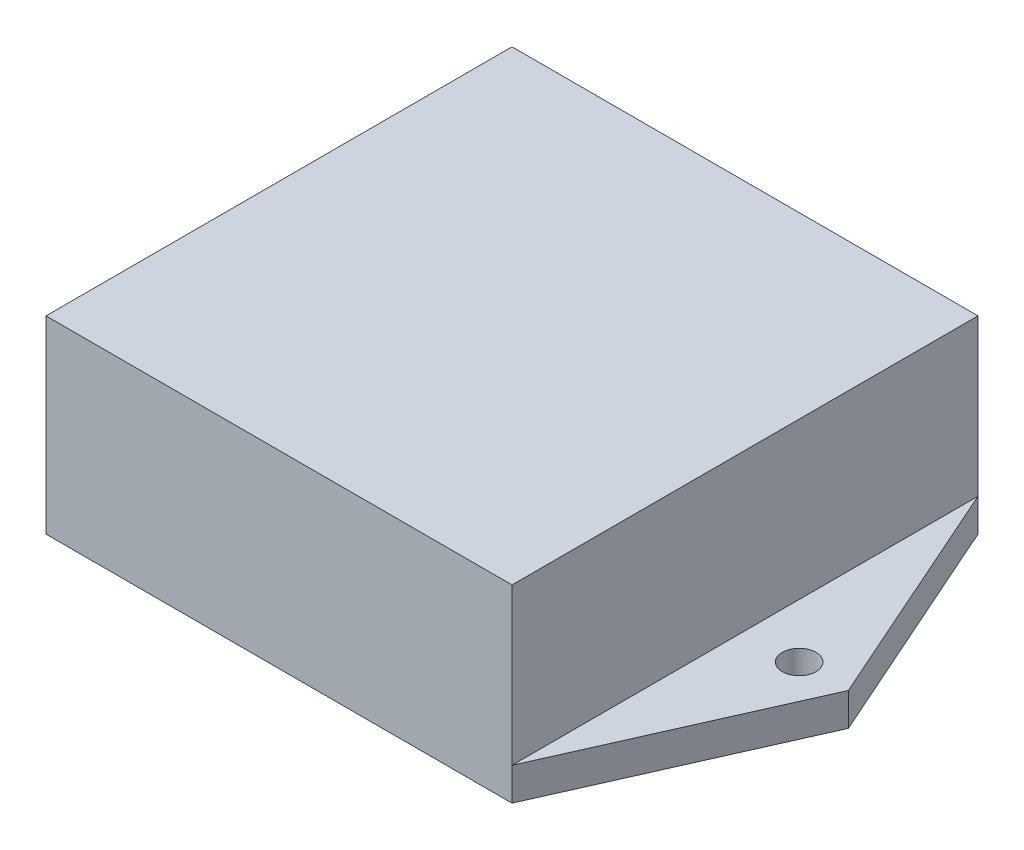
ISO-10303-21;
HEADER;
FILE_DESCRIPTION(('STEP AP214'),'2;1');
FILE_NAME('part.step','',(''),(''),'','','');
FILE_SCHEMA(('AUTOMOTIVE_DESIGN { 1 0 10303 214 1 1 1 1 }'));
ENDSEC;
DATA;
#1=APPLICATION_CONTEXT('core data for automotive mechanical design processes');
#2=APPLICATION_PROTOCOL_DEFINITION('international standard','automotive_design',2000,#1);
#3=PRODUCT_CONTEXT('',#1,'mechanical');
#4=PRODUCT('Part','Part','',(#3));
#5=PRODUCT_RELATED_PRODUCT_CATEGORY('part','',(#4));
#6=PRODUCT_DEFINITION_FORMATION('','',#4);
#7=PRODUCT_DEFINITION_CONTEXT('part definition',#1,'design');
#8=PRODUCT_DEFINITION('design','',#6,#7);
#9=PRODUCT_DEFINITION_SHAPE('','',#8);
#10=(LENGTH_UNIT() NAMED_UNIT(*) SI_UNIT(.MILLI.,.METRE.));
#11=(NAMED_UNIT(*) PLANE_ANGLE_UNIT() SI_UNIT($,.RADIAN.));
#12=(NAMED_UNIT(*) SI_UNIT($,.STERADIAN.) SOLID_ANGLE_UNIT());
#13=UNCERTAINTY_MEASURE_WITH_UNIT(LENGTH_MEASURE(1.E-05),#10,'distance_accuracy_value','');
#14=(GEOMETRIC_REPRESENTATION_CONTEXT(3) GLOBAL_UNCERTAINTY_ASSIGNED_CONTEXT((#13)) GLOBAL_UNIT_ASSIGNED_CONTEXT((#10,
#11,#12)) REPRESENTATION_CONTEXT('',''));
#15=CARTESIAN_POINT('',(0.,0.,0.));
#16=DIRECTION('',(0.,0.,1.));
#17=DIRECTION('',(1.,0.,0.));
#18=AXIS2_PLACEMENT_3D('',#15,#16,#17);
#19=CARTESIAN_POINT('',(0.,2.,0.));
#20=DIRECTION('',(0.,1.,0.));
#21=DIRECTION('',(0.,0.,1.));
#22=AXIS2_PLACEMENT_3D('',#19,#20,#21);
#23=PLANE('',#22);
#24=CARTESIAN_POINT('',(17.5,2.,0.));
#25=DIRECTION('',(0.,1.,0.));
#26=DIRECTION('',(0.,0.,1.));
#27=AXIS2_PLACEMENT_3D('',#24,#25,#26);
#28=CIRCLE('',#27,1.025);
#29=CARTESIAN_POINT('',(17.5,2.,1.025));
#30=VERTEX_POINT('',#29);
#31=EDGE_CURVE('E200',#30,#30,#28,.T.);
#32=ORIENTED_EDGE('',*,*,#31,.F.);
#33=EDGE_LOOP('',(#32));
#34=FACE_BOUND('',#33,.T.);
#35=DIRECTION('',(0.405541116982609,0.,0.914076803357627));
#36=VECTOR('',#35,1.);
#37=CARTESIAN_POINT('',(17.1284962499482,2.,-7.59926242075167));
#38=LINE('',#37,#36);
#39=CARTESIAN_POINT('',(14.2,2.,-14.2));
#40=VERTEX_POINT('',#39);
#41=CARTESIAN_POINT('',(20.5,2.,0.));
#42=VERTEX_POINT('',#41);
#43=EDGE_CURVE('E118',#40,#42,#38,.T.);
#44=ORIENTED_EDGE('',*,*,#43,.F.);
#45=DIRECTION('',(0.,0.,1.));
#46=VECTOR('',#45,1.);
#47=CARTESIAN_POINT('',(14.2,2.,0.));
#48=LINE('',#47,#46);
#49=CARTESIAN_POINT('',(14.2,2.,14.2));
#50=VERTEX_POINT('',#49);
#51=EDGE_CURVE('E106',#40,#50,#48,.T.);
#52=ORIENTED_EDGE('',*,*,#51,.T.);
#53=DIRECTION('',(-0.405541116982609,0.,0.914076803357627));
#54=VECTOR('',#53,1.);
#55=CARTESIAN_POINT('',(17.1284962499482,2.,7.59926242075167));
#56=LINE('',#55,#54);
#57=EDGE_CURVE('E129',#42,#50,#56,.T.);
#58=ORIENTED_EDGE('',*,*,#57,.F.);
#59=EDGE_LOOP('',(#44,#52,#58));
#60=FACE_BOUND('',#59,.T.);
#61=ADVANCED_FACE('F49',(#34,#60),#23,.T.);
#62=CARTESIAN_POINT('',(0.,2.,14.2));
#63=DIRECTION('',(0.,0.,-1.));
#64=DIRECTION('',(-1.,0.,0.));
#65=AXIS2_PLACEMENT_3D('',#62,#63,#64);
#66=PLANE('',#65);
#67=DIRECTION('',(1.,0.,0.));
#68=VECTOR('',#67,1.);
#69=CARTESIAN_POINT('',(0.,0.,14.2));
#70=LINE('',#69,#68);
#71=CARTESIAN_POINT('',(-14.2,0.,14.2));
#72=VERTEX_POINT('',#71);
#73=CARTESIAN_POINT('',(14.2,0.,14.2));
#74=VERTEX_POINT('',#73);
#75=EDGE_CURVE('E143',#72,#74,#70,.T.);
#76=ORIENTED_EDGE('',*,*,#75,.T.);
#77=DIRECTION('',(0.,-1.,0.));
#78=VECTOR('',#77,1.);
#79=CARTESIAN_POINT('',(14.2,2.,14.2));
#80=LINE('',#79,#78);
#81=EDGE_CURVE('E11',#50,#74,#80,.T.);
#82=ORIENTED_EDGE('',*,*,#81,.F.);
#83=DIRECTION('',(0.,-1.,0.));
#84=VECTOR('',#83,1.);
#85=CARTESIAN_POINT('',(14.2,11.52,14.2));
#86=LINE('',#85,#84);
#87=CARTESIAN_POINT('',(14.2,11.52,14.2));
#88=VERTEX_POINT('',#87);
#89=EDGE_CURVE('E141',#88,#50,#86,.T.);
#90=ORIENTED_EDGE('',*,*,#89,.F.);
#91=DIRECTION('',(1.,0.,0.));
#92=VECTOR('',#91,1.);
#93=CARTESIAN_POINT('',(0.,11.52,14.2));
#94=LINE('',#93,#92);
#95=CARTESIAN_POINT('',(-14.2,11.52,14.2));
#96=VERTEX_POINT('',#95);
#97=EDGE_CURVE('E199',#96,#88,#94,.T.);
#98=ORIENTED_EDGE('',*,*,#97,.F.);
#99=DIRECTION('',(0.,-1.,0.));
#100=VECTOR('',#99,1.);
#101=CARTESIAN_POINT('',(-14.2,11.52,14.2));
#102=LINE('',#101,#100);
#103=CARTESIAN_POINT('',(-14.2,2.,14.2));
#104=VERTEX_POINT('',#103);
#105=EDGE_CURVE('E157',#96,#104,#102,.T.);
#106=ORIENTED_EDGE('',*,*,#105,.T.);
#107=DIRECTION('',(0.,-1.,0.));
#108=VECTOR('',#107,1.);
#109=CARTESIAN_POINT('',(-14.2,2.,14.2));
#110=LINE('',#109,#108);
#111=EDGE_CURVE('E171',#104,#72,#110,.T.);
#112=ORIENTED_EDGE('',*,*,#111,.T.);
#113=EDGE_LOOP('',(#76,#82,#90,#98,#106,#112));
#114=FACE_BOUND('',#113,.T.);
#115=ADVANCED_FACE('F51',(#114),#66,.F.);
#116=CARTESIAN_POINT('',(17.1284962499482,2.,7.59926242075167));
#117=DIRECTION('',(0.914076803357627,0.,0.405541116982609));
#118=DIRECTION('',(0.405541116982609,0.,-0.914076803357627));
#119=AXIS2_PLACEMENT_3D('',#116,#117,#118);
#120=PLANE('',#119);
#121=DIRECTION('',(-0.405541116982609,0.,0.914076803357627));
#122=VECTOR('',#121,1.);
#123=CARTESIAN_POINT('',(17.1284962499482,0.,7.59926242075167));
#124=LINE('',#123,#122);
#125=CARTESIAN_POINT('',(20.5,0.,0.));
#126=VERTEX_POINT('',#125);
#127=EDGE_CURVE('E175',#126,#74,#124,.T.);
#128=ORIENTED_EDGE('',*,*,#127,.F.);
#129=DIRECTION('',(0.,-1.,0.));
#130=VECTOR('',#129,1.);
#131=CARTESIAN_POINT('',(20.5,2.,0.));
#132=LINE('',#131,#130);
#133=EDGE_CURVE('E60',#42,#126,#132,.T.);
#134=ORIENTED_EDGE('',*,*,#133,.F.);
#135=ORIENTED_EDGE('',*,*,#57,.T.);
#136=ORIENTED_EDGE('',*,*,#81,.T.);
#137=EDGE_LOOP('',(#128,#134,#135,#136));
#138=FACE_BOUND('',#137,.T.);
#139=ADVANCED_FACE('F244',(#138),#120,.T.);
#140=CARTESIAN_POINT('',(17.1284962499482,2.,-7.59926242075167));
#141=DIRECTION('',(0.914076803357627,0.,-0.405541116982609));
#142=DIRECTION('',(-0.405541116982609,0.,-0.914076803357627));
#143=AXIS2_PLACEMENT_3D('',#140,#141,#142);
#144=PLANE('',#143);
#145=DIRECTION('',(0.405541116982609,0.,0.914076803357627));
#146=VECTOR('',#145,1.);
#147=CARTESIAN_POINT('',(17.1284962499482,0.,-7.59926242075167));
#148=LINE('',#147,#146);
#149=CARTESIAN_POINT('',(14.2,0.,-14.2));
#150=VERTEX_POINT('',#149);
#151=EDGE_CURVE('E120',#150,#126,#148,.T.);
#152=ORIENTED_EDGE('',*,*,#151,.F.);
#153=DIRECTION('',(0.,-1.,0.));
#154=VECTOR('',#153,1.);
#155=CARTESIAN_POINT('',(14.2,2.,-14.2));
#156=LINE('',#155,#154);
#157=EDGE_CURVE('E116',#40,#150,#156,.T.);
#158=ORIENTED_EDGE('',*,*,#157,.F.);
#159=ORIENTED_EDGE('',*,*,#43,.T.);
#160=ORIENTED_EDGE('',*,*,#133,.T.);
#161=EDGE_LOOP('',(#152,#158,#159,#160));
#162=FACE_BOUND('',#161,.T.);
#163=ADVANCED_FACE('F117',(#162),#144,.T.);
#164=CARTESIAN_POINT('',(0.,2.,-14.2));
#165=DIRECTION('',(0.,0.,-1.));
#166=DIRECTION('',(-1.,0.,0.));
#167=AXIS2_PLACEMENT_3D('',#164,#165,#166);
#168=PLANE('',#167);
#169=DIRECTION('',(1.,0.,0.));
#170=VECTOR('',#169,1.);
#171=CARTESIAN_POINT('',(0.,0.,-14.2));
#172=LINE('',#171,#170);
#173=CARTESIAN_POINT('',(-14.2,0.,-14.2));
#174=VERTEX_POINT('',#173);
#175=EDGE_CURVE('E181',#174,#150,#172,.T.);
#176=ORIENTED_EDGE('',*,*,#175,.F.);
#177=DIRECTION('',(0.,-1.,0.));
#178=VECTOR('',#177,1.);
#179=CARTESIAN_POINT('',(-14.2,2.,-14.2));
#180=LINE('',#179,#178);
#181=CARTESIAN_POINT('',(-14.2,2.,-14.2));
#182=VERTEX_POINT('',#181);
#183=EDGE_CURVE('E126',#182,#174,#180,.T.);
#184=ORIENTED_EDGE('',*,*,#183,.F.);
#185=DIRECTION('',(0.,-1.,0.));
#186=VECTOR('',#185,1.);
#187=CARTESIAN_POINT('',(-14.2,11.52,-14.2));
#188=LINE('',#187,#186);
#189=CARTESIAN_POINT('',(-14.2,11.52,-14.2));
#190=VERTEX_POINT('',#189);
#191=EDGE_CURVE('E151',#190,#182,#188,.T.);
#192=ORIENTED_EDGE('',*,*,#191,.F.);
#193=DIRECTION('',(1.,0.,0.));
#194=VECTOR('',#193,1.);
#195=CARTESIAN_POINT('',(0.,11.52,-14.2));
#196=LINE('',#195,#194);
#197=CARTESIAN_POINT('',(14.2,11.52,-14.2));
#198=VERTEX_POINT('',#197);
#199=EDGE_CURVE('E149',#190,#198,#196,.T.);
#200=ORIENTED_EDGE('',*,*,#199,.T.);
#201=DIRECTION('',(0.,-1.,0.));
#202=VECTOR('',#201,1.);
#203=CARTESIAN_POINT('',(14.2,11.52,-14.2));
#204=LINE('',#203,#202);
#205=EDGE_CURVE('E138',#198,#40,#204,.T.);
#206=ORIENTED_EDGE('',*,*,#205,.T.);
#207=ORIENTED_EDGE('',*,*,#157,.T.);
#208=EDGE_LOOP('',(#176,#184,#192,#200,#206,#207));
#209=FACE_BOUND('',#208,.T.);
#210=ADVANCED_FACE('F146',(#209),#168,.T.);
#211=CARTESIAN_POINT('',(-17.1284962499482,2.,-7.59926242075168));
#212=DIRECTION('',(0.914076803357627,0.,0.40554111698261));
#213=DIRECTION('',(0.40554111698261,0.,-0.914076803357627));
#214=AXIS2_PLACEMENT_3D('',#211,#212,#213);
#215=PLANE('',#214);
#216=DIRECTION('',(-0.40554111698261,0.,0.914076803357627));
#217=VECTOR('',#216,1.);
#218=CARTESIAN_POINT('',(-17.1284962499482,0.,-7.59926242075168));
#219=LINE('',#218,#217);
#220=CARTESIAN_POINT('',(-20.5,0.,0.));
#221=VERTEX_POINT('',#220);
#222=EDGE_CURVE('E90',#174,#221,#219,.T.);
#223=ORIENTED_EDGE('',*,*,#222,.T.);
#224=DIRECTION('',(0.,-1.,0.));
#225=VECTOR('',#224,1.);
#226=CARTESIAN_POINT('',(-20.5,2.,0.));
#227=LINE('',#226,#225);
#228=CARTESIAN_POINT('',(-20.5,2.,0.));
#229=VERTEX_POINT('',#228);
#230=EDGE_CURVE('E190',#229,#221,#227,.T.);
#231=ORIENTED_EDGE('',*,*,#230,.F.);
#232=DIRECTION('',(-0.40554111698261,0.,0.914076803357627));
#233=VECTOR('',#232,1.);
#234=CARTESIAN_POINT('',(-17.1284962499482,2.,-7.59926242075168));
#235=LINE('',#234,#233);
#236=EDGE_CURVE('E69',#182,#229,#235,.T.);
#237=ORIENTED_EDGE('',*,*,#236,.F.);
#238=ORIENTED_EDGE('',*,*,#183,.T.);
#239=EDGE_LOOP('',(#223,#231,#237,#238));
#240=FACE_BOUND('',#239,.T.);
#241=ADVANCED_FACE('F248',(#240),#215,.F.);
#242=CARTESIAN_POINT('',(-17.1284962499482,2.,7.59926242075167));
#243=DIRECTION('',(0.914076803357627,0.,-0.405541116982609));
#244=DIRECTION('',(-0.405541116982609,0.,-0.914076803357627));
#245=AXIS2_PLACEMENT_3D('',#242,#243,#244);
#246=PLANE('',#245);
#247=DIRECTION('',(0.405541116982609,0.,0.914076803357627));
#248=VECTOR('',#247,1.);
#249=CARTESIAN_POINT('',(-17.1284962499482,0.,7.59926242075167));
#250=LINE('',#249,#248);
#251=EDGE_CURVE('E97',#221,#72,#250,.T.);
#252=ORIENTED_EDGE('',*,*,#251,.T.);
#253=ORIENTED_EDGE('',*,*,#111,.F.);
#254=DIRECTION('',(0.405541116982609,0.,0.914076803357627));
#255=VECTOR('',#254,1.);
#256=CARTESIAN_POINT('',(-17.1284962499482,2.,7.59926242075167));
#257=LINE('',#256,#255);
#258=EDGE_CURVE('E168',#229,#104,#257,.T.);
#259=ORIENTED_EDGE('',*,*,#258,.F.);
#260=ORIENTED_EDGE('',*,*,#230,.T.);
#261=EDGE_LOOP('',(#252,#253,#259,#260));
#262=FACE_BOUND('',#261,.T.);
#263=ADVANCED_FACE('F250',(#262),#246,.F.);
#264=CARTESIAN_POINT('',(-17.5,2.,0.));
#265=DIRECTION('',(0.,1.,0.));
#266=DIRECTION('',(0.,0.,1.));
#267=AXIS2_PLACEMENT_3D('',#264,#265,#266);
#268=CIRCLE('',#267,1.025);
#269=CARTESIAN_POINT('',(-17.5,2.,1.02499999999999));
#270=VERTEX_POINT('',#269);
#271=EDGE_CURVE('E214',#270,#270,#268,.T.);
#272=ORIENTED_EDGE('',*,*,#271,.F.);
#273=EDGE_LOOP('',(#272));
#274=FACE_BOUND('',#273,.T.);
#275=DIRECTION('',(0.,0.,1.));
#276=VECTOR('',#275,1.);
#277=CARTESIAN_POINT('',(-14.2,2.,0.));
#278=LINE('',#277,#276);
#279=EDGE_CURVE('E144',#182,#104,#278,.T.);
#280=ORIENTED_EDGE('',*,*,#279,.F.);
#281=ORIENTED_EDGE('',*,*,#236,.T.);
#282=ORIENTED_EDGE('',*,*,#258,.T.);
#283=EDGE_LOOP('',(#280,#281,#282));
#284=FACE_BOUND('',#283,.T.);
#285=ADVANCED_FACE('F251',(#274,#284),#23,.T.);
#286=CARTESIAN_POINT('',(0.,0.,0.));
#287=DIRECTION('',(0.,1.,0.));
#288=DIRECTION('',(0.,0.,1.));
#289=AXIS2_PLACEMENT_3D('',#286,#287,#288);
#290=PLANE('',#289);
#291=CARTESIAN_POINT('',(-17.5,0.,0.));
#292=DIRECTION('',(0.,1.,0.));
#293=DIRECTION('',(0.,0.,1.));
#294=AXIS2_PLACEMENT_3D('',#291,#292,#293);
#295=CIRCLE('',#294,1.025);
#296=CARTESIAN_POINT('',(-17.5,0.,1.02499999999999));
#297=VERTEX_POINT('',#296);
#298=EDGE_CURVE('E53',#297,#297,#295,.T.);
#299=ORIENTED_EDGE('',*,*,#298,.T.);
#300=EDGE_LOOP('',(#299));
#301=FACE_BOUND('',#300,.T.);
#302=CARTESIAN_POINT('',(17.5,0.,0.));
#303=DIRECTION('',(0.,1.,0.));
#304=DIRECTION('',(0.,0.,1.));
#305=AXIS2_PLACEMENT_3D('',#302,#303,#304);
#306=CIRCLE('',#305,1.025);
#307=CARTESIAN_POINT('',(17.5,0.,1.025));
#308=VERTEX_POINT('',#307);
#309=EDGE_CURVE('E196',#308,#308,#306,.T.);
#310=ORIENTED_EDGE('',*,*,#309,.T.);
#311=EDGE_LOOP('',(#310));
#312=FACE_BOUND('',#311,.T.);
#313=ORIENTED_EDGE('',*,*,#222,.F.);
#314=ORIENTED_EDGE('',*,*,#175,.T.);
#315=ORIENTED_EDGE('',*,*,#151,.T.);
#316=ORIENTED_EDGE('',*,*,#127,.T.);
#317=ORIENTED_EDGE('',*,*,#75,.F.);
#318=ORIENTED_EDGE('',*,*,#251,.F.);
#319=EDGE_LOOP('',(#313,#314,#315,#316,#317,#318));
#320=FACE_BOUND('',#319,.T.);
#321=ADVANCED_FACE('F246',(#301,#312,#320),#290,.F.);
#322=CARTESIAN_POINT('',(14.2,11.52,0.));
#323=DIRECTION('',(-1.,0.,0.));
#324=DIRECTION('',(0.,0.,1.));
#325=AXIS2_PLACEMENT_3D('',#322,#323,#324);
#326=PLANE('',#325);
#327=ORIENTED_EDGE('',*,*,#51,.F.);
#328=ORIENTED_EDGE('',*,*,#205,.F.);
#329=DIRECTION('',(0.,0.,-1.));
#330=VECTOR('',#329,1.);
#331=CARTESIAN_POINT('',(14.2,11.52,0.));
#332=LINE('',#331,#330);
#333=EDGE_CURVE('E206',#88,#198,#332,.T.);
#334=ORIENTED_EDGE('',*,*,#333,.F.);
#335=ORIENTED_EDGE('',*,*,#89,.T.);
#336=EDGE_LOOP('',(#327,#328,#334,#335));
#337=FACE_BOUND('',#336,.T.);
#338=ADVANCED_FACE('F135',(#337),#326,.F.);
#339=CARTESIAN_POINT('',(-14.2,11.52,0.));
#340=DIRECTION('',(-1.,0.,0.));
#341=DIRECTION('',(0.,0.,1.));
#342=AXIS2_PLACEMENT_3D('',#339,#340,#341);
#343=PLANE('',#342);
#344=ORIENTED_EDGE('',*,*,#191,.T.);
#345=ORIENTED_EDGE('',*,*,#279,.T.);
#346=ORIENTED_EDGE('',*,*,#105,.F.);
#347=DIRECTION('',(0.,0.,-1.));
#348=VECTOR('',#347,1.);
#349=CARTESIAN_POINT('',(-14.2,11.52,0.));
#350=LINE('',#349,#348);
#351=EDGE_CURVE('E222',#96,#190,#350,.T.);
#352=ORIENTED_EDGE('',*,*,#351,.T.);
#353=EDGE_LOOP('',(#344,#345,#346,#352));
#354=FACE_BOUND('',#353,.T.);
#355=ADVANCED_FACE('F234',(#354),#343,.T.);
#356=CARTESIAN_POINT('',(0.,11.52,0.));
#357=DIRECTION('',(0.,1.,0.));
#358=DIRECTION('',(0.,0.,1.));
#359=AXIS2_PLACEMENT_3D('',#356,#357,#358);
#360=PLANE('',#359);
#361=ORIENTED_EDGE('',*,*,#97,.T.);
#362=ORIENTED_EDGE('',*,*,#333,.T.);
#363=ORIENTED_EDGE('',*,*,#199,.F.);
#364=ORIENTED_EDGE('',*,*,#351,.F.);
#365=EDGE_LOOP('',(#361,#362,#363,#364));
#366=FACE_BOUND('',#365,.T.);
#367=ADVANCED_FACE('F241',(#366),#360,.T.);
#368=CARTESIAN_POINT('',(17.5,2.,0.));
#369=DIRECTION('',(0.,1.,0.));
#370=DIRECTION('',(0.,0.,1.));
#371=AXIS2_PLACEMENT_3D('',#368,#369,#370);
#372=CYLINDRICAL_SURFACE('',#371,1.025);
#373=ORIENTED_EDGE('',*,*,#31,.T.);
#374=EDGE_LOOP('',(#373));
#375=FACE_BOUND('',#374,.T.);
#376=ORIENTED_EDGE('',*,*,#309,.F.);
#377=EDGE_LOOP('',(#376));
#378=FACE_BOUND('',#377,.T.);
#379=ADVANCED_FACE('F307',(#375,#378),#372,.F.);
#380=CARTESIAN_POINT('',(-17.5,2.,0.));
#381=DIRECTION('',(0.,1.,0.));
#382=DIRECTION('',(0.,0.,1.));
#383=AXIS2_PLACEMENT_3D('',#380,#381,#382);
#384=CYLINDRICAL_SURFACE('',#383,1.025);
#385=ORIENTED_EDGE('',*,*,#271,.T.);
#386=EDGE_LOOP('',(#385));
#387=FACE_BOUND('',#386,.T.);
#388=ORIENTED_EDGE('',*,*,#298,.F.);
#389=EDGE_LOOP('',(#388));
#390=FACE_BOUND('',#389,.T.);
#391=ADVANCED_FACE('F337',(#387,#390),#384,.F.);
#392=CLOSED_SHELL('',(#61,#115,#139,#163,#210,#241,#263,#285,#321,#338,#355,#367,#379,#391));
#393=MANIFOLD_SOLID_BREP('B2',#392);
#394=ADVANCED_BREP_SHAPE_REPRESENTATION('',(#18,#393),#14);
#395=SHAPE_DEFINITION_REPRESENTATION(#9,#394);
ENDSEC;
END-ISO-10303-21;
